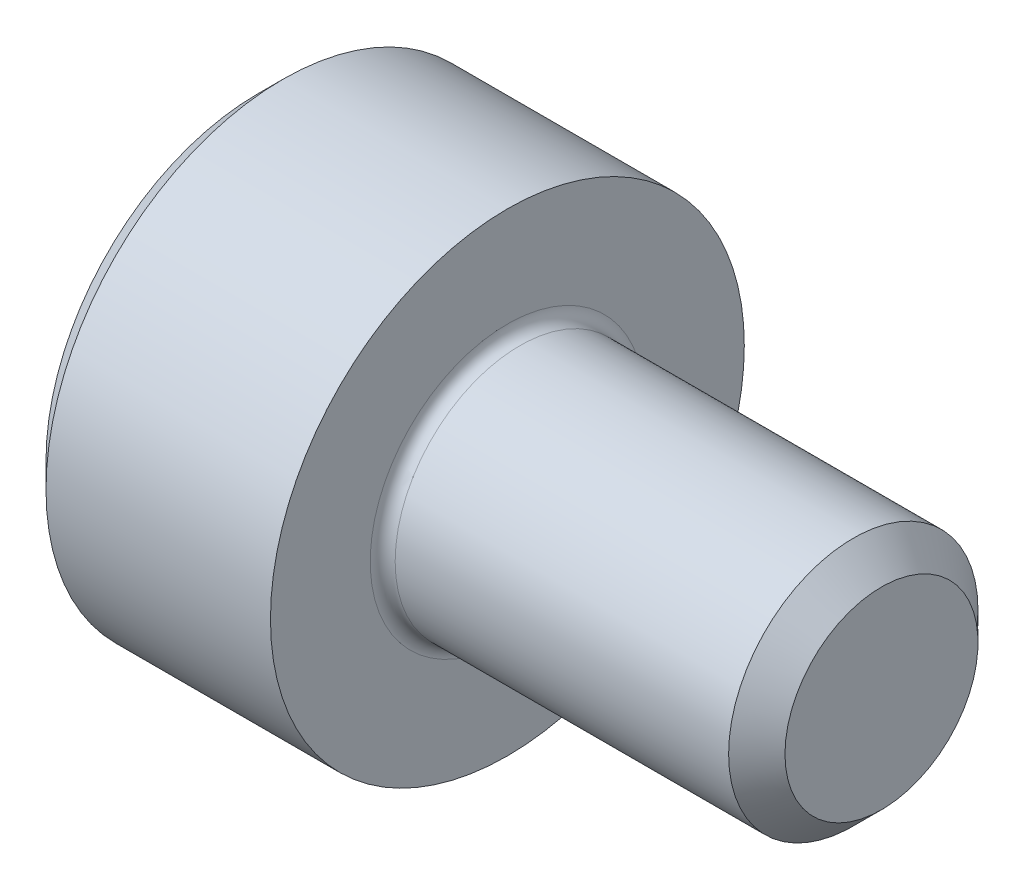
ISO-10303-21;
HEADER;
FILE_DESCRIPTION(('STEP AP214'),'2;1');
FILE_NAME('part.step','',(''),(''),'','','');
FILE_SCHEMA(('AUTOMOTIVE_DESIGN { 1 0 10303 214 1 1 1 1 }'));
ENDSEC;
DATA;
#1=APPLICATION_CONTEXT('core data for automotive mechanical design processes');
#2=APPLICATION_PROTOCOL_DEFINITION('international standard','automotive_design',2000,#1);
#3=PRODUCT_CONTEXT('',#1,'mechanical');
#4=PRODUCT('Part','Part','',(#3));
#5=PRODUCT_RELATED_PRODUCT_CATEGORY('part','',(#4));
#6=PRODUCT_DEFINITION_FORMATION('','',#4);
#7=PRODUCT_DEFINITION_CONTEXT('part definition',#1,'design');
#8=PRODUCT_DEFINITION('design','',#6,#7);
#9=PRODUCT_DEFINITION_SHAPE('','',#8);
#10=(LENGTH_UNIT() NAMED_UNIT(*) SI_UNIT(.MILLI.,.METRE.));
#11=(NAMED_UNIT(*) PLANE_ANGLE_UNIT() SI_UNIT($,.RADIAN.));
#12=(NAMED_UNIT(*) SI_UNIT($,.STERADIAN.) SOLID_ANGLE_UNIT());
#13=UNCERTAINTY_MEASURE_WITH_UNIT(LENGTH_MEASURE(1.E-05),#10,'distance_accuracy_value','');
#14=(GEOMETRIC_REPRESENTATION_CONTEXT(3) GLOBAL_UNCERTAINTY_ASSIGNED_CONTEXT((#13)) GLOBAL_UNIT_ASSIGNED_CONTEXT((#10,
#11,#12)) REPRESENTATION_CONTEXT('',''));
#15=CARTESIAN_POINT('',(0.,0.,0.));
#16=DIRECTION('',(0.,0.,1.));
#17=DIRECTION('',(1.,0.,0.));
#18=AXIS2_PLACEMENT_3D('',#15,#16,#17);
#19=CARTESIAN_POINT('',(0.,0.,0.));
#20=DIRECTION('',(-1.,0.,0.));
#21=DIRECTION('',(0.,0.,1.));
#22=AXIS2_PLACEMENT_3D('',#19,#20,#21);
#23=PLANE('',#22);
#24=DIRECTION('',(0.,-0.5,0.866025403784439));
#25=VECTOR('',#24,1.);
#26=CARTESIAN_POINT('',(0.,0.892006165897969,0.));
#27=LINE('',#26,#25);
#28=CARTESIAN_POINT('',(0.,0.892006165897969,0.));
#29=VERTEX_POINT('',#28);
#30=CARTESIAN_POINT('',(0.,0.446003082948983,0.772499999999996));
#31=VERTEX_POINT('',#30);
#32=EDGE_CURVE('E386',#29,#31,#27,.T.);
#33=ORIENTED_EDGE('',*,*,#32,.T.);
#34=DIRECTION('',(0.,1.,0.));
#35=VECTOR('',#34,1.);
#36=CARTESIAN_POINT('',(0.,-0.446003082948989,0.772499999999998));
#37=LINE('',#36,#35);
#38=CARTESIAN_POINT('',(0.,-0.446003082948989,0.772499999999998));
#39=VERTEX_POINT('',#38);
#40=EDGE_CURVE('E130',#39,#31,#37,.T.);
#41=ORIENTED_EDGE('',*,*,#40,.F.);
#42=DIRECTION('',(0.,-0.500000000000001,-0.866025403784438));
#43=VECTOR('',#42,1.);
#44=CARTESIAN_POINT('',(0.,-0.446003082948989,0.772499999999998));
#45=LINE('',#44,#43);
#46=CARTESIAN_POINT('',(0.,-0.892006165897976,0.));
#47=VERTEX_POINT('',#46);
#48=EDGE_CURVE('E389',#39,#47,#45,.T.);
#49=ORIENTED_EDGE('',*,*,#48,.T.);
#50=DIRECTION('',(0.,0.5,-0.866025403784439));
#51=VECTOR('',#50,1.);
#52=CARTESIAN_POINT('',(0.,-0.892006165897976,0.));
#53=LINE('',#52,#51);
#54=CARTESIAN_POINT('',(0.,-0.44600308294899,-0.772500000000002));
#55=VERTEX_POINT('',#54);
#56=EDGE_CURVE('E392',#47,#55,#53,.T.);
#57=ORIENTED_EDGE('',*,*,#56,.T.);
#58=DIRECTION('',(0.,-1.,0.));
#59=VECTOR('',#58,1.);
#60=CARTESIAN_POINT('',(0.,0.446003082948982,-0.772500000000003));
#61=LINE('',#60,#59);
#62=CARTESIAN_POINT('',(0.,0.446003082948982,-0.772500000000003));
#63=VERTEX_POINT('',#62);
#64=EDGE_CURVE('E395',#63,#55,#61,.T.);
#65=ORIENTED_EDGE('',*,*,#64,.F.);
#66=DIRECTION('',(0.,-0.500000000000001,-0.866025403784438));
#67=VECTOR('',#66,1.);
#68=CARTESIAN_POINT('',(0.,0.892006165897969,0.));
#69=LINE('',#68,#67);
#70=EDGE_CURVE('E125',#29,#63,#69,.T.);
#71=ORIENTED_EDGE('',*,*,#70,.F.);
#72=EDGE_LOOP('',(#33,#41,#49,#57,#65,#71));
#73=FACE_BOUND('',#72,.T.);
#74=CARTESIAN_POINT('',(0.,0.,0.));
#75=DIRECTION('',(-1.,0.,0.));
#76=DIRECTION('',(0.,0.,1.));
#77=AXIS2_PLACEMENT_3D('',#74,#75,#76);
#78=CIRCLE('',#77,1.7);
#79=CARTESIAN_POINT('',(0.,0.,1.7));
#80=VERTEX_POINT('',#79);
#81=EDGE_CURVE('E141',#80,#80,#78,.T.);
#82=ORIENTED_EDGE('',*,*,#81,.T.);
#83=EDGE_LOOP('',(#82));
#84=FACE_BOUND('',#83,.T.);
#85=ADVANCED_FACE('F34',(#73,#84),#23,.T.);
#86=CARTESIAN_POINT('',(5.,0.774,0.));
#87=DIRECTION('',(1.,0.,0.));
#88=DIRECTION('',(0.,0.,-1.));
#89=AXIS2_PLACEMENT_3D('',#86,#87,#88);
#90=PLANE('',#89);
#91=CARTESIAN_POINT('',(5.,0.,0.));
#92=DIRECTION('',(-1.,0.,0.));
#93=DIRECTION('',(0.,0.,1.));
#94=AXIS2_PLACEMENT_3D('',#91,#92,#93);
#95=CIRCLE('',#94,0.774);
#96=CARTESIAN_POINT('',(5.,0.,0.774));
#97=VERTEX_POINT('',#96);
#98=EDGE_CURVE('E154',#97,#97,#95,.T.);
#99=ORIENTED_EDGE('',*,*,#98,.F.);
#100=EDGE_LOOP('',(#99));
#101=FACE_BOUND('',#100,.T.);
#102=ADVANCED_FACE('F175',(#101),#90,.T.);
#103=CARTESIAN_POINT('',(5.,0.,0.));
#104=DIRECTION('',(-1.,0.,0.));
#105=DIRECTION('',(0.,0.,1.));
#106=AXIS2_PLACEMENT_3D('',#103,#104,#105);
#107=CONICAL_SURFACE('',#106,0.774,0.785398163397439);
#108=CARTESIAN_POINT('',(4.774,0.,0.));
#109=DIRECTION('',(-1.,0.,0.));
#110=DIRECTION('',(0.,0.,1.));
#111=AXIS2_PLACEMENT_3D('',#108,#109,#110);
#112=CIRCLE('',#111,1.);
#113=CARTESIAN_POINT('',(4.774,0.,1.));
#114=VERTEX_POINT('',#113);
#115=EDGE_CURVE('E151',#114,#114,#112,.T.);
#116=ORIENTED_EDGE('',*,*,#115,.F.);
#117=EDGE_LOOP('',(#116));
#118=FACE_BOUND('',#117,.T.);
#119=ORIENTED_EDGE('',*,*,#98,.T.);
#120=EDGE_LOOP('',(#119));
#121=FACE_BOUND('',#120,.T.);
#122=ADVANCED_FACE('F181',(#118,#121),#107,.T.);
#123=CARTESIAN_POINT('',(-31.75,0.,0.));
#124=DIRECTION('',(-1.,0.,0.));
#125=DIRECTION('',(0.,0.,1.));
#126=AXIS2_PLACEMENT_3D('',#123,#124,#125);
#127=CYLINDRICAL_SURFACE('',#126,1.);
#128=CARTESIAN_POINT('',(2.1,0.,0.));
#129=DIRECTION('',(1.,0.,0.));
#130=DIRECTION('',(0.,0.,-1.));
#131=AXIS2_PLACEMENT_3D('',#128,#129,#130);
#132=CIRCLE('',#131,1.);
#133=CARTESIAN_POINT('',(2.1,0.,-1.));
#134=VERTEX_POINT('',#133);
#135=EDGE_CURVE('E11',#134,#134,#132,.T.);
#136=ORIENTED_EDGE('',*,*,#135,.T.);
#137=EDGE_LOOP('',(#136));
#138=FACE_BOUND('',#137,.T.);
#139=ORIENTED_EDGE('',*,*,#115,.T.);
#140=EDGE_LOOP('',(#139));
#141=FACE_BOUND('',#140,.T.);
#142=ADVANCED_FACE('F192',(#138,#141),#127,.T.);
#143=CARTESIAN_POINT('',(2.,1.9,0.));
#144=DIRECTION('',(1.,0.,0.));
#145=DIRECTION('',(0.,0.,-1.));
#146=AXIS2_PLACEMENT_3D('',#143,#144,#145);
#147=PLANE('',#146);
#148=CARTESIAN_POINT('',(2.,0.,0.));
#149=DIRECTION('',(1.,0.,0.));
#150=DIRECTION('',(0.,0.,-1.));
#151=AXIS2_PLACEMENT_3D('',#148,#149,#150);
#152=CIRCLE('',#151,1.1);
#153=CARTESIAN_POINT('',(2.,0.,-1.1));
#154=VERTEX_POINT('',#153);
#155=EDGE_CURVE('E42',#154,#154,#152,.F.);
#156=ORIENTED_EDGE('',*,*,#155,.T.);
#157=EDGE_LOOP('',(#156));
#158=FACE_BOUND('',#157,.T.);
#159=CARTESIAN_POINT('',(2.,0.,0.));
#160=DIRECTION('',(-1.,0.,0.));
#161=DIRECTION('',(0.,0.,1.));
#162=AXIS2_PLACEMENT_3D('',#159,#160,#161);
#163=CIRCLE('',#162,1.9);
#164=CARTESIAN_POINT('',(2.,0.,1.9));
#165=VERTEX_POINT('',#164);
#166=EDGE_CURVE('E148',#165,#165,#163,.T.);
#167=ORIENTED_EDGE('',*,*,#166,.F.);
#168=EDGE_LOOP('',(#167));
#169=FACE_BOUND('',#168,.T.);
#170=ADVANCED_FACE('F159',(#158,#169),#147,.T.);
#171=CARTESIAN_POINT('',(-31.75,0.,0.));
#172=DIRECTION('',(-1.,0.,0.));
#173=DIRECTION('',(0.,0.,1.));
#174=AXIS2_PLACEMENT_3D('',#171,#172,#173);
#175=CYLINDRICAL_SURFACE('',#174,1.9);
#176=ORIENTED_EDGE('',*,*,#166,.T.);
#177=EDGE_LOOP('',(#176));
#178=FACE_BOUND('',#177,.T.);
#179=CARTESIAN_POINT('',(0.199999999999999,0.,0.));
#180=DIRECTION('',(-1.,0.,0.));
#181=DIRECTION('',(0.,0.,1.));
#182=AXIS2_PLACEMENT_3D('',#179,#180,#181);
#183=CIRCLE('',#182,1.9);
#184=CARTESIAN_POINT('',(0.199999999999999,0.,1.9));
#185=VERTEX_POINT('',#184);
#186=EDGE_CURVE('E145',#185,#185,#183,.T.);
#187=ORIENTED_EDGE('',*,*,#186,.F.);
#188=EDGE_LOOP('',(#187));
#189=FACE_BOUND('',#188,.T.);
#190=ADVANCED_FACE('F170',(#178,#189),#175,.T.);
#191=CARTESIAN_POINT('',(0.,0.,0.));
#192=DIRECTION('',(1.,0.,0.));
#193=DIRECTION('',(0.,0.,-1.));
#194=AXIS2_PLACEMENT_3D('',#191,#192,#193);
#195=CONICAL_SURFACE('',#194,1.7,0.785398163397453);
#196=ORIENTED_EDGE('',*,*,#186,.T.);
#197=EDGE_LOOP('',(#196));
#198=FACE_BOUND('',#197,.T.);
#199=ORIENTED_EDGE('',*,*,#81,.F.);
#200=EDGE_LOOP('',(#199));
#201=FACE_BOUND('',#200,.T.);
#202=ADVANCED_FACE('F163',(#198,#201),#195,.T.);
#203=CARTESIAN_POINT('',(2.1,0.,0.));
#204=DIRECTION('',(1.,0.,0.));
#205=DIRECTION('',(0.,0.,-1.));
#206=AXIS2_PLACEMENT_3D('',#203,#204,#205);
#207=TOROIDAL_SURFACE('',#206,1.1,0.1);
#208=ORIENTED_EDGE('',*,*,#135,.F.);
#209=EDGE_LOOP('',(#208));
#210=FACE_BOUND('',#209,.T.);
#211=ORIENTED_EDGE('',*,*,#155,.F.);
#212=EDGE_LOOP('',(#211));
#213=FACE_BOUND('',#212,.T.);
#214=ADVANCED_FACE('F36',(#210,#213),#207,.F.);
#215=CARTESIAN_POINT('',(1.,0.892006165897969,0.));
#216=DIRECTION('',(0.,-0.866025403784439,-0.5));
#217=DIRECTION('',(0.,0.5,-0.866025403784439));
#218=AXIS2_PLACEMENT_3D('',#215,#216,#217);
#219=PLANE('',#218);
#220=ORIENTED_EDGE('',*,*,#32,.F.);
#221=DIRECTION('',(-1.,0.,0.));
#222=VECTOR('',#221,1.);
#223=CARTESIAN_POINT('',(1.,0.892006165897969,0.));
#224=LINE('',#223,#222);
#225=CARTESIAN_POINT('',(1.,0.892006165897969,0.));
#226=VERTEX_POINT('',#225);
#227=EDGE_CURVE('E376',#226,#29,#224,.T.);
#228=ORIENTED_EDGE('',*,*,#227,.F.);
#229=DIRECTION('',(0.,-0.5,0.866025403784439));
#230=VECTOR('',#229,1.);
#231=CARTESIAN_POINT('',(1.,0.892006165897969,0.));
#232=LINE('',#231,#230);
#233=CARTESIAN_POINT('',(1.,0.669004624423475,0.386249999999998));
#234=VERTEX_POINT('',#233);
#235=EDGE_CURVE('E117',#226,#234,#232,.T.);
#236=ORIENTED_EDGE('',*,*,#235,.T.);
#237=CARTESIAN_POINT('',(1.,0.446003082948983,0.772499999999996));
#238=VERTEX_POINT('',#237);
#239=EDGE_CURVE('E108',#234,#238,#232,.T.);
#240=ORIENTED_EDGE('',*,*,#239,.T.);
#241=DIRECTION('',(-1.,0.,0.));
#242=VECTOR('',#241,1.);
#243=CARTESIAN_POINT('',(1.,0.446003082948983,0.772499999999996));
#244=LINE('',#243,#242);
#245=EDGE_CURVE('E122',#238,#31,#244,.T.);
#246=ORIENTED_EDGE('',*,*,#245,.T.);
#247=EDGE_LOOP('',(#220,#228,#236,#240,#246));
#248=FACE_BOUND('',#247,.T.);
#249=ADVANCED_FACE('F121',(#248),#219,.T.);
#250=CARTESIAN_POINT('',(1.,-0.446003082948989,0.772499999999998));
#251=DIRECTION('',(0.,0.,1.));
#252=DIRECTION('',(0.,-1.,0.));
#253=AXIS2_PLACEMENT_3D('',#250,#251,#252);
#254=PLANE('',#253);
#255=ORIENTED_EDGE('',*,*,#40,.T.);
#256=ORIENTED_EDGE('',*,*,#245,.F.);
#257=DIRECTION('',(0.,1.,0.));
#258=VECTOR('',#257,1.);
#259=CARTESIAN_POINT('',(1.,-0.446003082948989,0.772499999999998));
#260=LINE('',#259,#258);
#261=CARTESIAN_POINT('',(1.,0.,0.772499999999997));
#262=VERTEX_POINT('',#261);
#263=EDGE_CURVE('E105',#262,#238,#260,.T.);
#264=ORIENTED_EDGE('',*,*,#263,.F.);
#265=CARTESIAN_POINT('',(1.,-0.446003082948989,0.772499999999998));
#266=VERTEX_POINT('',#265);
#267=EDGE_CURVE('E116',#266,#262,#260,.T.);
#268=ORIENTED_EDGE('',*,*,#267,.F.);
#269=DIRECTION('',(-1.,0.,0.));
#270=VECTOR('',#269,1.);
#271=CARTESIAN_POINT('',(1.,-0.446003082948989,0.772499999999998));
#272=LINE('',#271,#270);
#273=EDGE_CURVE('E132',#266,#39,#272,.T.);
#274=ORIENTED_EDGE('',*,*,#273,.T.);
#275=EDGE_LOOP('',(#255,#256,#264,#268,#274));
#276=FACE_BOUND('',#275,.T.);
#277=ADVANCED_FACE('F127',(#276),#254,.F.);
#278=CARTESIAN_POINT('',(1.,-0.446003082948989,0.772499999999998));
#279=DIRECTION('',(0.,0.866025403784438,-0.500000000000001));
#280=DIRECTION('',(0.,0.500000000000001,0.866025403784438));
#281=AXIS2_PLACEMENT_3D('',#278,#279,#280);
#282=PLANE('',#281);
#283=ORIENTED_EDGE('',*,*,#48,.F.);
#284=ORIENTED_EDGE('',*,*,#273,.F.);
#285=DIRECTION('',(0.,-0.500000000000001,-0.866025403784438));
#286=VECTOR('',#285,1.);
#287=CARTESIAN_POINT('',(1.,-0.446003082948989,0.772499999999998));
#288=LINE('',#287,#286);
#289=CARTESIAN_POINT('',(1.,-0.66900462442348,0.386250000000002));
#290=VERTEX_POINT('',#289);
#291=EDGE_CURVE('E415',#266,#290,#288,.T.);
#292=ORIENTED_EDGE('',*,*,#291,.T.);
#293=CARTESIAN_POINT('',(1.,-0.892006165897976,0.));
#294=VERTEX_POINT('',#293);
#295=EDGE_CURVE('E404',#290,#294,#288,.T.);
#296=ORIENTED_EDGE('',*,*,#295,.T.);
#297=DIRECTION('',(-1.,0.,0.));
#298=VECTOR('',#297,1.);
#299=CARTESIAN_POINT('',(1.,-0.892006165897976,0.));
#300=LINE('',#299,#298);
#301=EDGE_CURVE('E137',#294,#47,#300,.T.);
#302=ORIENTED_EDGE('',*,*,#301,.T.);
#303=EDGE_LOOP('',(#283,#284,#292,#296,#302));
#304=FACE_BOUND('',#303,.T.);
#305=ADVANCED_FACE('F267',(#304),#282,.T.);
#306=CARTESIAN_POINT('',(1.,-0.892006165897976,0.));
#307=DIRECTION('',(0.,0.866025403784439,0.5));
#308=DIRECTION('',(0.,-0.5,0.866025403784439));
#309=AXIS2_PLACEMENT_3D('',#306,#307,#308);
#310=PLANE('',#309);
#311=ORIENTED_EDGE('',*,*,#56,.F.);
#312=ORIENTED_EDGE('',*,*,#301,.F.);
#313=DIRECTION('',(0.,0.5,-0.866025403784439));
#314=VECTOR('',#313,1.);
#315=CARTESIAN_POINT('',(1.,-0.892006165897976,0.));
#316=LINE('',#315,#314);
#317=CARTESIAN_POINT('',(1.,-0.669004624423483,-0.386250000000002));
#318=VERTEX_POINT('',#317);
#319=EDGE_CURVE('E382',#294,#318,#316,.T.);
#320=ORIENTED_EDGE('',*,*,#319,.T.);
#321=CARTESIAN_POINT('',(1.,-0.44600308294899,-0.772500000000002));
#322=VERTEX_POINT('',#321);
#323=EDGE_CURVE('E414',#318,#322,#316,.T.);
#324=ORIENTED_EDGE('',*,*,#323,.T.);
#325=DIRECTION('',(-1.,0.,0.));
#326=VECTOR('',#325,1.);
#327=CARTESIAN_POINT('',(1.,-0.44600308294899,-0.772500000000002));
#328=LINE('',#327,#326);
#329=EDGE_CURVE('E375',#322,#55,#328,.T.);
#330=ORIENTED_EDGE('',*,*,#329,.T.);
#331=EDGE_LOOP('',(#311,#312,#320,#324,#330));
#332=FACE_BOUND('',#331,.T.);
#333=ADVANCED_FACE('F275',(#332),#310,.T.);
#334=CARTESIAN_POINT('',(1.,0.446003082948982,-0.772500000000003));
#335=DIRECTION('',(0.,0.,-1.));
#336=DIRECTION('',(0.,1.,0.));
#337=AXIS2_PLACEMENT_3D('',#334,#335,#336);
#338=PLANE('',#337);
#339=ORIENTED_EDGE('',*,*,#64,.T.);
#340=ORIENTED_EDGE('',*,*,#329,.F.);
#341=DIRECTION('',(0.,-1.,0.));
#342=VECTOR('',#341,1.);
#343=CARTESIAN_POINT('',(1.,0.446003082948982,-0.772500000000003));
#344=LINE('',#343,#342);
#345=CARTESIAN_POINT('',(1.,0.,-0.7725));
#346=VERTEX_POINT('',#345);
#347=EDGE_CURVE('E379',#346,#322,#344,.T.);
#348=ORIENTED_EDGE('',*,*,#347,.F.);
#349=CARTESIAN_POINT('',(1.,0.446003082948982,-0.772500000000003));
#350=VERTEX_POINT('',#349);
#351=EDGE_CURVE('E49',#350,#346,#344,.T.);
#352=ORIENTED_EDGE('',*,*,#351,.F.);
#353=DIRECTION('',(-1.,0.,0.));
#354=VECTOR('',#353,1.);
#355=CARTESIAN_POINT('',(1.,0.446003082948982,-0.772500000000003));
#356=LINE('',#355,#354);
#357=EDGE_CURVE('E372',#350,#63,#356,.T.);
#358=ORIENTED_EDGE('',*,*,#357,.T.);
#359=EDGE_LOOP('',(#339,#340,#348,#352,#358));
#360=FACE_BOUND('',#359,.T.);
#361=ADVANCED_FACE('F284',(#360),#338,.F.);
#362=CARTESIAN_POINT('',(1.,0.892006165897969,0.));
#363=DIRECTION('',(0.,0.866025403784438,-0.500000000000001));
#364=DIRECTION('',(0.,0.500000000000001,0.866025403784438));
#365=AXIS2_PLACEMENT_3D('',#362,#363,#364);
#366=PLANE('',#365);
#367=ORIENTED_EDGE('',*,*,#70,.T.);
#368=ORIENTED_EDGE('',*,*,#357,.F.);
#369=DIRECTION('',(0.,-0.500000000000001,-0.866025403784438));
#370=VECTOR('',#369,1.);
#371=CARTESIAN_POINT('',(1.,0.892006165897969,0.));
#372=LINE('',#371,#370);
#373=CARTESIAN_POINT('',(1.,0.669004624423477,-0.38625));
#374=VERTEX_POINT('',#373);
#375=EDGE_CURVE('E362',#374,#350,#372,.T.);
#376=ORIENTED_EDGE('',*,*,#375,.F.);
#377=EDGE_CURVE('E368',#226,#374,#372,.T.);
#378=ORIENTED_EDGE('',*,*,#377,.F.);
#379=ORIENTED_EDGE('',*,*,#227,.T.);
#380=EDGE_LOOP('',(#367,#368,#376,#378,#379));
#381=FACE_BOUND('',#380,.T.);
#382=ADVANCED_FACE('F293',(#381),#366,.F.);
#383=CARTESIAN_POINT('',(1.,0.892006165897969,0.));
#384=DIRECTION('',(1.,0.,0.));
#385=DIRECTION('',(0.,0.,-1.));
#386=AXIS2_PLACEMENT_3D('',#383,#384,#385);
#387=PLANE('',#386);
#388=ORIENTED_EDGE('',*,*,#347,.T.);
#389=ORIENTED_EDGE('',*,*,#323,.F.);
#390=CARTESIAN_POINT('',(1.,0.,0.));
#391=DIRECTION('',(-1.,0.,0.));
#392=DIRECTION('',(0.,0.,1.));
#393=AXIS2_PLACEMENT_3D('',#390,#391,#392);
#394=CIRCLE('',#393,0.7725);
#395=EDGE_CURVE('E410',#346,#318,#394,.T.);
#396=ORIENTED_EDGE('',*,*,#395,.F.);
#397=EDGE_LOOP('',(#388,#389,#396));
#398=FACE_BOUND('',#397,.T.);
#399=ADVANCED_FACE('F302',(#398),#387,.F.);
#400=ORIENTED_EDGE('',*,*,#319,.F.);
#401=ORIENTED_EDGE('',*,*,#295,.F.);
#402=EDGE_CURVE('E135',#318,#290,#394,.T.);
#403=ORIENTED_EDGE('',*,*,#402,.F.);
#404=EDGE_LOOP('',(#400,#401,#403));
#405=FACE_BOUND('',#404,.T.);
#406=ADVANCED_FACE('F311',(#405),#387,.F.);
#407=ORIENTED_EDGE('',*,*,#291,.F.);
#408=ORIENTED_EDGE('',*,*,#267,.T.);
#409=EDGE_CURVE('E131',#290,#262,#394,.T.);
#410=ORIENTED_EDGE('',*,*,#409,.F.);
#411=EDGE_LOOP('',(#407,#408,#410));
#412=FACE_BOUND('',#411,.T.);
#413=ADVANCED_FACE('F320',(#412),#387,.F.);
#414=ORIENTED_EDGE('',*,*,#263,.T.);
#415=ORIENTED_EDGE('',*,*,#239,.F.);
#416=EDGE_CURVE('E111',#262,#234,#394,.T.);
#417=ORIENTED_EDGE('',*,*,#416,.F.);
#418=EDGE_LOOP('',(#414,#415,#417));
#419=FACE_BOUND('',#418,.T.);
#420=ADVANCED_FACE('F107',(#419),#387,.F.);
#421=ORIENTED_EDGE('',*,*,#235,.F.);
#422=ORIENTED_EDGE('',*,*,#377,.T.);
#423=EDGE_CURVE('E142',#234,#374,#394,.T.);
#424=ORIENTED_EDGE('',*,*,#423,.F.);
#425=EDGE_LOOP('',(#421,#422,#424));
#426=FACE_BOUND('',#425,.T.);
#427=ADVANCED_FACE('F335',(#426),#387,.F.);
#428=ORIENTED_EDGE('',*,*,#375,.T.);
#429=ORIENTED_EDGE('',*,*,#351,.T.);
#430=EDGE_CURVE('E365',#374,#346,#394,.T.);
#431=ORIENTED_EDGE('',*,*,#430,.F.);
#432=EDGE_LOOP('',(#428,#429,#431));
#433=FACE_BOUND('',#432,.T.);
#434=ADVANCED_FACE('F250',(#433),#387,.F.);
#435=CARTESIAN_POINT('',(1.,0.,0.));
#436=DIRECTION('',(-1.,0.,0.));
#437=DIRECTION('',(0.,0.,1.));
#438=AXIS2_PLACEMENT_3D('',#435,#436,#437);
#439=CONICAL_SURFACE('',#438,0.7725,1.04719755119659);
#440=CARTESIAN_POINT('',(1.446003082949,0.,0.));
#441=VERTEX_POINT('',#440);
#442=VERTEX_LOOP('',#441);
#443=FACE_BOUND('',#442,.T.);
#444=ORIENTED_EDGE('',*,*,#416,.T.);
#445=ORIENTED_EDGE('',*,*,#423,.T.);
#446=ORIENTED_EDGE('',*,*,#430,.T.);
#447=ORIENTED_EDGE('',*,*,#395,.T.);
#448=ORIENTED_EDGE('',*,*,#402,.T.);
#449=ORIENTED_EDGE('',*,*,#409,.T.);
#450=EDGE_LOOP('',(#444,#445,#446,#447,#448,#449));
#451=FACE_BOUND('',#450,.T.);
#452=ADVANCED_FACE('F185',(#443,#451),#439,.F.);
#453=CLOSED_SHELL('',(#85,#102,#122,#142,#170,#190,#202,#214,#249,#277,#305,#333,#361,#382,#399,
#406,#413,#420,#427,#434,#452));
#454=MANIFOLD_SOLID_BREP('B2',#453);
#455=ADVANCED_BREP_SHAPE_REPRESENTATION('',(#18,#454),#14);
#456=SHAPE_DEFINITION_REPRESENTATION(#9,#455);
ENDSEC;
END-ISO-10303-21;
